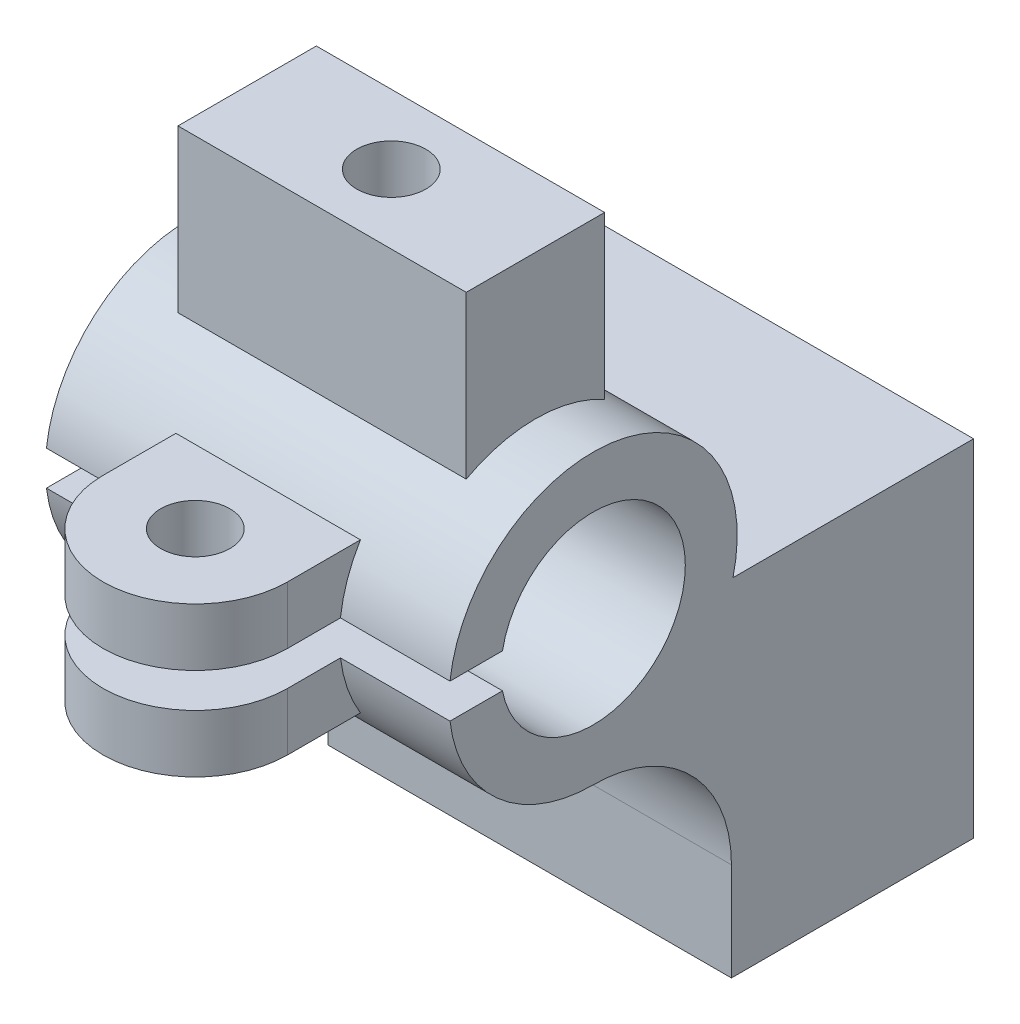
ISO-10303-21;
HEADER;
FILE_DESCRIPTION(('STEP AP214'),'2;1');
FILE_NAME('part.step','',(''),(''),'','','');
FILE_SCHEMA(('AUTOMOTIVE_DESIGN { 1 0 10303 214 1 1 1 1 }'));
ENDSEC;
DATA;
#1=APPLICATION_CONTEXT('core data for automotive mechanical design processes');
#2=APPLICATION_PROTOCOL_DEFINITION('international standard','automotive_design',2000,#1);
#3=PRODUCT_CONTEXT('',#1,'mechanical');
#4=PRODUCT('Part','Part','',(#3));
#5=PRODUCT_RELATED_PRODUCT_CATEGORY('part','',(#4));
#6=PRODUCT_DEFINITION_FORMATION('','',#4);
#7=PRODUCT_DEFINITION_CONTEXT('part definition',#1,'design');
#8=PRODUCT_DEFINITION('design','',#6,#7);
#9=PRODUCT_DEFINITION_SHAPE('','',#8);
#10=(LENGTH_UNIT() NAMED_UNIT(*) SI_UNIT(.MILLI.,.METRE.));
#11=(NAMED_UNIT(*) PLANE_ANGLE_UNIT() SI_UNIT($,.RADIAN.));
#12=(NAMED_UNIT(*) SI_UNIT($,.STERADIAN.) SOLID_ANGLE_UNIT());
#13=UNCERTAINTY_MEASURE_WITH_UNIT(LENGTH_MEASURE(1.E-05),#10,'distance_accuracy_value','');
#14=(GEOMETRIC_REPRESENTATION_CONTEXT(3) GLOBAL_UNCERTAINTY_ASSIGNED_CONTEXT((#13)) GLOBAL_UNIT_ASSIGNED_CONTEXT((#10,
#11,#12)) REPRESENTATION_CONTEXT('',''));
#15=CARTESIAN_POINT('',(0.,0.,0.));
#16=DIRECTION('',(0.,0.,1.));
#17=DIRECTION('',(1.,0.,0.));
#18=AXIS2_PLACEMENT_3D('',#15,#16,#17);
#19=CARTESIAN_POINT('',(8.,6.49999999999988,0.));
#20=DIRECTION('',(0.,-1.,0.));
#21=DIRECTION('',(0.,0.,-1.));
#22=AXIS2_PLACEMENT_3D('',#19,#20,#21);
#23=PLANE('',#22);
#24=DIRECTION('',(0.,0.,1.));
#25=VECTOR('',#24,1.);
#26=CARTESIAN_POINT('',(-8.,6.49999999999988,0.));
#27=LINE('',#26,#25);
#28=CARTESIAN_POINT('',(-8.,6.49999999999988,10.6770782520314));
#29=VERTEX_POINT('',#28);
#30=CARTESIAN_POINT('',(-8.,6.49999999999987,17.));
#31=VERTEX_POINT('',#30);
#32=EDGE_CURVE('E759',#29,#31,#27,.T.);
#33=ORIENTED_EDGE('',*,*,#32,.T.);
#34=CARTESIAN_POINT('',(0.,6.49999999999987,17.));
#35=DIRECTION('',(0.,-1.,0.));
#36=DIRECTION('',(0.,0.,-1.));
#37=AXIS2_PLACEMENT_3D('',#34,#35,#36);
#38=CIRCLE('',#37,8.);
#39=CARTESIAN_POINT('',(8.,6.49999999999987,17.));
#40=VERTEX_POINT('',#39);
#41=EDGE_CURVE('E244',#31,#40,#38,.F.);
#42=ORIENTED_EDGE('',*,*,#41,.T.);
#43=DIRECTION('',(0.,0.,1.));
#44=VECTOR('',#43,1.);
#45=CARTESIAN_POINT('',(8.,6.49999999999988,0.));
#46=LINE('',#45,#44);
#47=CARTESIAN_POINT('',(8.,6.49999999999988,10.6770782520314));
#48=VERTEX_POINT('',#47);
#49=EDGE_CURVE('E742',#48,#40,#46,.T.);
#50=ORIENTED_EDGE('',*,*,#49,.F.);
#51=DIRECTION('',(-1.,0.,0.));
#52=VECTOR('',#51,1.);
#53=CARTESIAN_POINT('',(8.,6.49999999999988,10.6770782520314));
#54=LINE('',#53,#52);
#55=EDGE_CURVE('E751',#48,#29,#54,.T.);
#56=ORIENTED_EDGE('',*,*,#55,.T.);
#57=EDGE_LOOP('',(#33,#42,#50,#56));
#58=FACE_BOUND('',#57,.T.);
#59=CARTESIAN_POINT('',(0.,6.49999999999987,17.));
#60=DIRECTION('',(0.,1.,0.));
#61=DIRECTION('',(0.,0.,1.));
#62=AXIS2_PLACEMENT_3D('',#59,#60,#61);
#63=CIRCLE('',#62,3.);
#64=CARTESIAN_POINT('',(0.,6.49999999999987,20.));
#65=VERTEX_POINT('',#64);
#66=EDGE_CURVE('E839',#65,#65,#63,.T.);
#67=ORIENTED_EDGE('',*,*,#66,.F.);
#68=EDGE_LOOP('',(#67));
#69=FACE_BOUND('',#68,.T.);
#70=ADVANCED_FACE('F47',(#58,#69),#23,.F.);
#71=CARTESIAN_POINT('',(0.,-1.49999999999993,17.));
#72=DIRECTION('',(0.,-1.,0.));
#73=DIRECTION('',(0.,0.,-1.));
#74=AXIS2_PLACEMENT_3D('',#71,#72,#73);
#75=CYLINDRICAL_SURFACE('',#74,8.);
#76=DIRECTION('',(0.,1.,0.));
#77=VECTOR('',#76,1.);
#78=CARTESIAN_POINT('',(8.,-1.49999999999993,17.));
#79=LINE('',#78,#77);
#80=CARTESIAN_POINT('',(8.,-1.49999999999993,17.));
#81=VERTEX_POINT('',#80);
#82=CARTESIAN_POINT('',(8.,-6.49999999999987,17.));
#83=VERTEX_POINT('',#82);
#84=EDGE_CURVE('E250',#81,#83,#79,.F.);
#85=ORIENTED_EDGE('',*,*,#84,.F.);
#86=CARTESIAN_POINT('',(0.,-1.5,17.));
#87=DIRECTION('',(0.,1.,0.));
#88=DIRECTION('',(0.,0.,1.));
#89=AXIS2_PLACEMENT_3D('',#86,#87,#88);
#90=CIRCLE('',#89,8.);
#91=CARTESIAN_POINT('',(-8.,-1.49999999999993,17.));
#92=VERTEX_POINT('',#91);
#93=EDGE_CURVE('E58',#92,#81,#90,.T.);
#94=ORIENTED_EDGE('',*,*,#93,.F.);
#95=DIRECTION('',(0.,-1.,0.));
#96=VECTOR('',#95,1.);
#97=CARTESIAN_POINT('',(-8.,0.,17.));
#98=LINE('',#97,#96);
#99=CARTESIAN_POINT('',(-8.,-6.49999999999987,17.));
#100=VERTEX_POINT('',#99);
#101=EDGE_CURVE('E253',#100,#92,#98,.F.);
#102=ORIENTED_EDGE('',*,*,#101,.F.);
#103=CARTESIAN_POINT('',(0.,-6.49999999999988,17.));
#104=DIRECTION('',(0.,-1.,0.));
#105=DIRECTION('',(0.,0.,-1.));
#106=AXIS2_PLACEMENT_3D('',#103,#104,#105);
#107=CIRCLE('',#106,8.);
#108=EDGE_CURVE('E11',#83,#100,#107,.T.);
#109=ORIENTED_EDGE('',*,*,#108,.F.);
#110=EDGE_LOOP('',(#85,#94,#102,#109));
#111=FACE_BOUND('',#110,.T.);
#112=ADVANCED_FACE('F50',(#111),#75,.T.);
#113=CARTESIAN_POINT('',(0.,6.49999999999987,17.));
#114=DIRECTION('',(0.,1.,0.));
#115=DIRECTION('',(0.,0.,1.));
#116=AXIS2_PLACEMENT_3D('',#113,#114,#115);
#117=CYLINDRICAL_SURFACE('',#116,8.);
#118=DIRECTION('',(0.,1.,0.));
#119=VECTOR('',#118,1.);
#120=CARTESIAN_POINT('',(8.,0.,17.));
#121=LINE('',#120,#119);
#122=CARTESIAN_POINT('',(8.,1.49999999999993,17.));
#123=VERTEX_POINT('',#122);
#124=EDGE_CURVE('E235',#40,#123,#121,.F.);
#125=ORIENTED_EDGE('',*,*,#124,.F.);
#126=ORIENTED_EDGE('',*,*,#41,.F.);
#127=DIRECTION('',(0.,-1.,0.));
#128=VECTOR('',#127,1.);
#129=CARTESIAN_POINT('',(-8.,6.49999999999987,17.));
#130=LINE('',#129,#128);
#131=CARTESIAN_POINT('',(-8.,1.49999999999993,17.));
#132=VERTEX_POINT('',#131);
#133=EDGE_CURVE('E239',#132,#31,#130,.F.);
#134=ORIENTED_EDGE('',*,*,#133,.F.);
#135=CARTESIAN_POINT('',(0.,1.5,17.));
#136=DIRECTION('',(0.,1.,0.));
#137=DIRECTION('',(0.,0.,1.));
#138=AXIS2_PLACEMENT_3D('',#135,#136,#137);
#139=CIRCLE('',#138,8.);
#140=EDGE_CURVE('E247',#123,#132,#139,.F.);
#141=ORIENTED_EDGE('',*,*,#140,.F.);
#142=EDGE_LOOP('',(#125,#126,#134,#141));
#143=FACE_BOUND('',#142,.T.);
#144=ADVANCED_FACE('F413',(#143),#117,.T.);
#145=CARTESIAN_POINT('',(-17.5,-1.5,0.));
#146=DIRECTION('',(0.,1.,0.));
#147=DIRECTION('',(0.,0.,1.));
#148=AXIS2_PLACEMENT_3D('',#145,#146,#147);
#149=PLANE('',#148);
#150=CARTESIAN_POINT('',(0.,-1.5,17.));
#151=DIRECTION('',(0.,1.,0.));
#152=DIRECTION('',(0.,0.,1.));
#153=AXIS2_PLACEMENT_3D('',#150,#151,#152);
#154=CIRCLE('',#153,3.);
#155=CARTESIAN_POINT('',(0.,-1.5,20.));
#156=VERTEX_POINT('',#155);
#157=EDGE_CURVE('E828',#156,#156,#154,.T.);
#158=ORIENTED_EDGE('',*,*,#157,.F.);
#159=EDGE_LOOP('',(#158));
#160=FACE_BOUND('',#159,.T.);
#161=DIRECTION('',(0.,0.,1.));
#162=VECTOR('',#161,1.);
#163=CARTESIAN_POINT('',(-8.,-1.50000000000006,0.));
#164=LINE('',#163,#162);
#165=CARTESIAN_POINT('',(-8.,-1.5,12.4096736459909));
#166=VERTEX_POINT('',#165);
#167=EDGE_CURVE('E822',#166,#92,#164,.T.);
#168=ORIENTED_EDGE('',*,*,#167,.T.);
#169=ORIENTED_EDGE('',*,*,#93,.T.);
#170=DIRECTION('',(0.,0.,1.));
#171=VECTOR('',#170,1.);
#172=CARTESIAN_POINT('',(8.,-1.50000000000006,0.));
#173=LINE('',#172,#171);
#174=CARTESIAN_POINT('',(8.,-1.5,12.4096736459909));
#175=VERTEX_POINT('',#174);
#176=EDGE_CURVE('E196',#175,#81,#173,.T.);
#177=ORIENTED_EDGE('',*,*,#176,.F.);
#178=DIRECTION('',(1.,0.,0.));
#179=VECTOR('',#178,1.);
#180=CARTESIAN_POINT('',(-17.5,-1.5,12.4096736459909));
#181=LINE('',#180,#179);
#182=CARTESIAN_POINT('',(17.5,-1.5,12.4096736459909));
#183=VERTEX_POINT('',#182);
#184=EDGE_CURVE('E202',#175,#183,#181,.T.);
#185=ORIENTED_EDGE('',*,*,#184,.T.);
#186=DIRECTION('',(0.,0.,1.));
#187=VECTOR('',#186,1.);
#188=CARTESIAN_POINT('',(17.5,-1.5,0.));
#189=LINE('',#188,#187);
#190=CARTESIAN_POINT('',(17.5,-1.5,7.85811682275086));
#191=VERTEX_POINT('',#190);
#192=EDGE_CURVE('E303',#191,#183,#189,.T.);
#193=ORIENTED_EDGE('',*,*,#192,.F.);
#194=DIRECTION('',(1.,0.,0.));
#195=VECTOR('',#194,1.);
#196=CARTESIAN_POINT('',(-17.5,-1.5,7.85811682275086));
#197=LINE('',#196,#195);
#198=CARTESIAN_POINT('',(-17.5,-1.5,7.85811682275086));
#199=VERTEX_POINT('',#198);
#200=EDGE_CURVE('E240',#199,#191,#197,.T.);
#201=ORIENTED_EDGE('',*,*,#200,.F.);
#202=DIRECTION('',(0.,0.,1.));
#203=VECTOR('',#202,1.);
#204=CARTESIAN_POINT('',(-17.5,-1.5,0.));
#205=LINE('',#204,#203);
#206=CARTESIAN_POINT('',(-17.5,-1.5,12.4096736459909));
#207=VERTEX_POINT('',#206);
#208=EDGE_CURVE('E334',#199,#207,#205,.T.);
#209=ORIENTED_EDGE('',*,*,#208,.T.);
#210=EDGE_CURVE('E223',#207,#166,#181,.T.);
#211=ORIENTED_EDGE('',*,*,#210,.T.);
#212=EDGE_LOOP('',(#168,#169,#177,#185,#193,#201,#209,#211));
#213=FACE_BOUND('',#212,.T.);
#214=ADVANCED_FACE('F199',(#160,#213),#149,.T.);
#215=CARTESIAN_POINT('',(-17.5,0.,0.));
#216=DIRECTION('',(1.,0.,0.));
#217=DIRECTION('',(0.,0.,-1.));
#218=AXIS2_PLACEMENT_3D('',#215,#216,#217);
#219=CYLINDRICAL_SURFACE('',#218,8.);
#220=CARTESIAN_POINT('',(17.5,0.,0.));
#221=DIRECTION('',(1.,0.,0.));
#222=DIRECTION('',(0.,0.,-1.));
#223=AXIS2_PLACEMENT_3D('',#220,#221,#222);
#224=CIRCLE('',#223,8.);
#225=CARTESIAN_POINT('',(17.5,1.5,7.85811682275086));
#226=VERTEX_POINT('',#225);
#227=EDGE_CURVE('E332',#191,#226,#224,.T.);
#228=ORIENTED_EDGE('',*,*,#227,.T.);
#229=DIRECTION('',(1.,0.,0.));
#230=VECTOR('',#229,1.);
#231=CARTESIAN_POINT('',(-17.5,1.5,7.85811682275086));
#232=LINE('',#231,#230);
#233=CARTESIAN_POINT('',(-17.5,1.5,7.85811682275086));
#234=VERTEX_POINT('',#233);
#235=EDGE_CURVE('E259',#234,#226,#232,.T.);
#236=ORIENTED_EDGE('',*,*,#235,.F.);
#237=CARTESIAN_POINT('',(-17.5,0.,0.));
#238=DIRECTION('',(1.,0.,0.));
#239=DIRECTION('',(0.,0.,-1.));
#240=AXIS2_PLACEMENT_3D('',#237,#238,#239);
#241=CIRCLE('',#240,8.);
#242=EDGE_CURVE('E224',#199,#234,#241,.T.);
#243=ORIENTED_EDGE('',*,*,#242,.F.);
#244=ORIENTED_EDGE('',*,*,#200,.T.);
#245=EDGE_LOOP('',(#228,#236,#243,#244));
#246=FACE_BOUND('',#245,.T.);
#247=ADVANCED_FACE('F404',(#246),#219,.F.);
#248=CARTESIAN_POINT('',(-17.5,1.5,0.));
#249=DIRECTION('',(0.,1.,0.));
#250=DIRECTION('',(0.,0.,1.));
#251=AXIS2_PLACEMENT_3D('',#248,#249,#250);
#252=PLANE('',#251);
#253=CARTESIAN_POINT('',(0.,1.5,17.));
#254=DIRECTION('',(0.,1.,0.));
#255=DIRECTION('',(0.,0.,1.));
#256=AXIS2_PLACEMENT_3D('',#253,#254,#255);
#257=CIRCLE('',#256,3.);
#258=CARTESIAN_POINT('',(0.,1.5,20.));
#259=VERTEX_POINT('',#258);
#260=EDGE_CURVE('E832',#259,#259,#257,.T.);
#261=ORIENTED_EDGE('',*,*,#260,.T.);
#262=EDGE_LOOP('',(#261));
#263=FACE_BOUND('',#262,.T.);
#264=DIRECTION('',(0.,0.,1.));
#265=VECTOR('',#264,1.);
#266=CARTESIAN_POINT('',(8.,1.50000000000006,0.));
#267=LINE('',#266,#265);
#268=CARTESIAN_POINT('',(8.,1.5,12.4096736459909));
#269=VERTEX_POINT('',#268);
#270=EDGE_CURVE('E747',#269,#123,#267,.T.);
#271=ORIENTED_EDGE('',*,*,#270,.T.);
#272=ORIENTED_EDGE('',*,*,#140,.T.);
#273=DIRECTION('',(0.,0.,1.));
#274=VECTOR('',#273,1.);
#275=CARTESIAN_POINT('',(-8.,1.50000000000006,0.));
#276=LINE('',#275,#274);
#277=CARTESIAN_POINT('',(-8.,1.5,12.4096736459909));
#278=VERTEX_POINT('',#277);
#279=EDGE_CURVE('E380',#278,#132,#276,.T.);
#280=ORIENTED_EDGE('',*,*,#279,.F.);
#281=DIRECTION('',(1.,0.,0.));
#282=VECTOR('',#281,1.);
#283=CARTESIAN_POINT('',(-17.5,1.5,12.4096736459909));
#284=LINE('',#283,#282);
#285=CARTESIAN_POINT('',(-17.5,1.5,12.4096736459909));
#286=VERTEX_POINT('',#285);
#287=EDGE_CURVE('E263',#286,#278,#284,.T.);
#288=ORIENTED_EDGE('',*,*,#287,.F.);
#289=DIRECTION('',(0.,0.,1.));
#290=VECTOR('',#289,1.);
#291=CARTESIAN_POINT('',(-17.5,1.5,0.));
#292=LINE('',#291,#290);
#293=EDGE_CURVE('E230',#234,#286,#292,.T.);
#294=ORIENTED_EDGE('',*,*,#293,.F.);
#295=ORIENTED_EDGE('',*,*,#235,.T.);
#296=DIRECTION('',(0.,0.,1.));
#297=VECTOR('',#296,1.);
#298=CARTESIAN_POINT('',(17.5,1.5,0.));
#299=LINE('',#298,#297);
#300=CARTESIAN_POINT('',(17.5,1.5,12.4096736459909));
#301=VERTEX_POINT('',#300);
#302=EDGE_CURVE('E328',#226,#301,#299,.T.);
#303=ORIENTED_EDGE('',*,*,#302,.T.);
#304=EDGE_CURVE('E267',#269,#301,#284,.T.);
#305=ORIENTED_EDGE('',*,*,#304,.F.);
#306=EDGE_LOOP('',(#271,#272,#280,#288,#294,#295,#303,#305));
#307=FACE_BOUND('',#306,.T.);
#308=ADVANCED_FACE('F378',(#263,#307),#252,.F.);
#309=CARTESIAN_POINT('',(-17.5,0.,0.));
#310=DIRECTION('',(1.,0.,0.));
#311=DIRECTION('',(0.,0.,-1.));
#312=AXIS2_PLACEMENT_3D('',#309,#310,#311);
#313=CYLINDRICAL_SURFACE('',#312,12.5);
#314=CARTESIAN_POINT('',(8.,0.,0.));
#315=DIRECTION('',(1.,0.,0.));
#316=DIRECTION('',(0.,0.,-1.));
#317=AXIS2_PLACEMENT_3D('',#314,#315,#316);
#318=CIRCLE('',#317,12.5);
#319=EDGE_CURVE('E743',#48,#269,#318,.T.);
#320=ORIENTED_EDGE('',*,*,#319,.T.);
#321=ORIENTED_EDGE('',*,*,#304,.T.);
#322=CARTESIAN_POINT('',(17.5,0.,0.));
#323=DIRECTION('',(1.,0.,0.));
#324=DIRECTION('',(0.,0.,-1.));
#325=AXIS2_PLACEMENT_3D('',#322,#323,#324);
#326=CIRCLE('',#325,12.5);
#327=CARTESIAN_POINT('',(17.5,-3.,-12.1346610995116));
#328=VERTEX_POINT('',#327);
#329=EDGE_CURVE('E324',#328,#301,#326,.T.);
#330=ORIENTED_EDGE('',*,*,#329,.F.);
#331=DIRECTION('',(1.,0.,0.));
#332=VECTOR('',#331,1.);
#333=CARTESIAN_POINT('',(-17.5,-3.,-12.1346610995116));
#334=LINE('',#333,#332);
#335=CARTESIAN_POINT('',(-17.5,-3.,-12.1346610995116));
#336=VERTEX_POINT('',#335);
#337=EDGE_CURVE('E270',#336,#328,#334,.T.);
#338=ORIENTED_EDGE('',*,*,#337,.F.);
#339=CARTESIAN_POINT('',(-17.5,0.,0.));
#340=DIRECTION('',(1.,0.,0.));
#341=DIRECTION('',(0.,0.,-1.));
#342=AXIS2_PLACEMENT_3D('',#339,#340,#341);
#343=CIRCLE('',#342,12.5);
#344=EDGE_CURVE('E363',#336,#286,#343,.T.);
#345=ORIENTED_EDGE('',*,*,#344,.T.);
#346=ORIENTED_EDGE('',*,*,#287,.T.);
#347=CARTESIAN_POINT('',(-8.,0.,0.));
#348=DIRECTION('',(1.,0.,0.));
#349=DIRECTION('',(0.,0.,-1.));
#350=AXIS2_PLACEMENT_3D('',#347,#348,#349);
#351=CIRCLE('',#350,12.5);
#352=EDGE_CURVE('E756',#29,#278,#351,.T.);
#353=ORIENTED_EDGE('',*,*,#352,.F.);
#354=ORIENTED_EDGE('',*,*,#55,.F.);
#355=EDGE_LOOP('',(#320,#321,#330,#338,#345,#346,#353,#354));
#356=FACE_BOUND('',#355,.T.);
#357=CARTESIAN_POINT('',(12.5,0.,0.));
#358=DIRECTION('',(1.,0.,0.));
#359=DIRECTION('',(0.,0.,-1.));
#360=AXIS2_PLACEMENT_3D('',#357,#358,#359);
#361=CIRCLE('',#360,12.5);
#362=CARTESIAN_POINT('',(12.5,10.9658560997307,-6.));
#363=VERTEX_POINT('',#362);
#364=CARTESIAN_POINT('',(12.5,10.9658560997307,6.));
#365=VERTEX_POINT('',#364);
#366=EDGE_CURVE('E768',#363,#365,#361,.T.);
#367=ORIENTED_EDGE('',*,*,#366,.T.);
#368=DIRECTION('',(-1.,0.,0.));
#369=VECTOR('',#368,1.);
#370=CARTESIAN_POINT('',(12.5,10.9658560997307,6.));
#371=LINE('',#370,#369);
#372=CARTESIAN_POINT('',(-12.5,10.9658560997307,6.));
#373=VERTEX_POINT('',#372);
#374=EDGE_CURVE('E783',#365,#373,#371,.T.);
#375=ORIENTED_EDGE('',*,*,#374,.T.);
#376=CARTESIAN_POINT('',(-12.5,0.,0.));
#377=DIRECTION('',(1.,0.,0.));
#378=DIRECTION('',(0.,0.,-1.));
#379=AXIS2_PLACEMENT_3D('',#376,#377,#378);
#380=CIRCLE('',#379,12.5);
#381=CARTESIAN_POINT('',(-12.5,10.9658560997307,-6.));
#382=VERTEX_POINT('',#381);
#383=EDGE_CURVE('E767',#382,#373,#380,.T.);
#384=ORIENTED_EDGE('',*,*,#383,.F.);
#385=DIRECTION('',(-1.,0.,0.));
#386=VECTOR('',#385,1.);
#387=CARTESIAN_POINT('',(12.5,10.9658560997307,-6.));
#388=LINE('',#387,#386);
#389=EDGE_CURVE('E307',#363,#382,#388,.T.);
#390=ORIENTED_EDGE('',*,*,#389,.F.);
#391=EDGE_LOOP('',(#367,#375,#384,#390));
#392=FACE_BOUND('',#391,.T.);
#393=ADVANCED_FACE('F384',(#356,#392),#313,.T.);
#394=CARTESIAN_POINT('',(-17.5,-3.,0.));
#395=DIRECTION('',(0.,1.,0.));
#396=DIRECTION('',(0.,0.,1.));
#397=AXIS2_PLACEMENT_3D('',#394,#395,#396);
#398=PLANE('',#397);
#399=DIRECTION('',(0.,0.,1.));
#400=VECTOR('',#399,1.);
#401=CARTESIAN_POINT('',(17.5,-3.,0.));
#402=LINE('',#401,#400);
#403=CARTESIAN_POINT('',(17.5,-3.,-33.));
#404=VERTEX_POINT('',#403);
#405=EDGE_CURVE('E320',#404,#328,#402,.T.);
#406=ORIENTED_EDGE('',*,*,#405,.F.);
#407=DIRECTION('',(1.,0.,0.));
#408=VECTOR('',#407,1.);
#409=CARTESIAN_POINT('',(-17.5,-3.,-33.));
#410=LINE('',#409,#408);
#411=CARTESIAN_POINT('',(-17.5,-3.,-33.));
#412=VERTEX_POINT('',#411);
#413=EDGE_CURVE('E272',#412,#404,#410,.T.);
#414=ORIENTED_EDGE('',*,*,#413,.F.);
#415=DIRECTION('',(0.,0.,1.));
#416=VECTOR('',#415,1.);
#417=CARTESIAN_POINT('',(-17.5,-3.,0.));
#418=LINE('',#417,#416);
#419=EDGE_CURVE('E359',#412,#336,#418,.T.);
#420=ORIENTED_EDGE('',*,*,#419,.T.);
#421=ORIENTED_EDGE('',*,*,#337,.T.);
#422=EDGE_LOOP('',(#406,#414,#420,#421));
#423=FACE_BOUND('',#422,.T.);
#424=ADVANCED_FACE('F389',(#423),#398,.T.);
#425=CARTESIAN_POINT('',(-17.5,0.,-33.));
#426=DIRECTION('',(0.,0.,1.));
#427=DIRECTION('',(0.,-1.,0.));
#428=AXIS2_PLACEMENT_3D('',#425,#426,#427);
#429=PLANE('',#428);
#430=DIRECTION('',(0.,-1.,0.));
#431=VECTOR('',#430,1.);
#432=CARTESIAN_POINT('',(17.5,0.,-33.));
#433=LINE('',#432,#431);
#434=CARTESIAN_POINT('',(17.5,-33.,-33.));
#435=VERTEX_POINT('',#434);
#436=EDGE_CURVE('E316',#404,#435,#433,.T.);
#437=ORIENTED_EDGE('',*,*,#436,.T.);
#438=DIRECTION('',(1.,0.,0.));
#439=VECTOR('',#438,1.);
#440=CARTESIAN_POINT('',(-17.5,-33.,-33.));
#441=LINE('',#440,#439);
#442=CARTESIAN_POINT('',(-17.5,-33.,-33.));
#443=VERTEX_POINT('',#442);
#444=EDGE_CURVE('E275',#443,#435,#441,.T.);
#445=ORIENTED_EDGE('',*,*,#444,.F.);
#446=DIRECTION('',(0.,-1.,0.));
#447=VECTOR('',#446,1.);
#448=CARTESIAN_POINT('',(-17.5,0.,-33.));
#449=LINE('',#448,#447);
#450=EDGE_CURVE('E356',#412,#443,#449,.T.);
#451=ORIENTED_EDGE('',*,*,#450,.F.);
#452=ORIENTED_EDGE('',*,*,#413,.T.);
#453=EDGE_LOOP('',(#437,#445,#451,#452));
#454=FACE_BOUND('',#453,.T.);
#455=ADVANCED_FACE('F394',(#454),#429,.F.);
#456=CARTESIAN_POINT('',(-17.5,-33.,0.));
#457=DIRECTION('',(0.,-1.,0.));
#458=DIRECTION('',(0.,0.,-1.));
#459=AXIS2_PLACEMENT_3D('',#456,#457,#458);
#460=PLANE('',#459);
#461=DIRECTION('',(0.,0.,-1.));
#462=VECTOR('',#461,1.);
#463=CARTESIAN_POINT('',(17.5,-33.,0.));
#464=LINE('',#463,#462);
#465=CARTESIAN_POINT('',(17.5,-33.,-12.));
#466=VERTEX_POINT('',#465);
#467=EDGE_CURVE('E312',#466,#435,#464,.T.);
#468=ORIENTED_EDGE('',*,*,#467,.F.);
#469=DIRECTION('',(1.,0.,0.));
#470=VECTOR('',#469,1.);
#471=CARTESIAN_POINT('',(-17.5,-33.,-12.));
#472=LINE('',#471,#470);
#473=CARTESIAN_POINT('',(-17.5,-33.,-12.));
#474=VERTEX_POINT('',#473);
#475=EDGE_CURVE('E278',#474,#466,#472,.T.);
#476=ORIENTED_EDGE('',*,*,#475,.F.);
#477=DIRECTION('',(0.,0.,-1.));
#478=VECTOR('',#477,1.);
#479=CARTESIAN_POINT('',(-17.5,-33.,0.));
#480=LINE('',#479,#478);
#481=EDGE_CURVE('E352',#474,#443,#480,.T.);
#482=ORIENTED_EDGE('',*,*,#481,.T.);
#483=ORIENTED_EDGE('',*,*,#444,.T.);
#484=EDGE_LOOP('',(#468,#476,#482,#483));
#485=FACE_BOUND('',#484,.T.);
#486=ADVANCED_FACE('F398',(#485),#460,.T.);
#487=CARTESIAN_POINT('',(-17.5,0.,-12.));
#488=DIRECTION('',(0.,0.,-1.));
#489=DIRECTION('',(0.,1.,0.));
#490=AXIS2_PLACEMENT_3D('',#487,#488,#489);
#491=PLANE('',#490);
#492=DIRECTION('',(0.,1.,0.));
#493=VECTOR('',#492,1.);
#494=CARTESIAN_POINT('',(17.5,0.,-12.));
#495=LINE('',#494,#493);
#496=CARTESIAN_POINT('',(17.5,-24.5,-12.));
#497=VERTEX_POINT('',#496);
#498=EDGE_CURVE('E299',#466,#497,#495,.T.);
#499=ORIENTED_EDGE('',*,*,#498,.T.);
#500=DIRECTION('',(1.,0.,0.));
#501=VECTOR('',#500,1.);
#502=CARTESIAN_POINT('',(-17.5,-24.5,-12.));
#503=LINE('',#502,#501);
#504=CARTESIAN_POINT('',(-17.5,-24.5,-12.));
#505=VERTEX_POINT('',#504);
#506=EDGE_CURVE('E281',#505,#497,#503,.T.);
#507=ORIENTED_EDGE('',*,*,#506,.F.);
#508=DIRECTION('',(0.,1.,0.));
#509=VECTOR('',#508,1.);
#510=CARTESIAN_POINT('',(-17.5,0.,-12.));
#511=LINE('',#510,#509);
#512=EDGE_CURVE('E349',#474,#505,#511,.T.);
#513=ORIENTED_EDGE('',*,*,#512,.F.);
#514=ORIENTED_EDGE('',*,*,#475,.T.);
#515=EDGE_LOOP('',(#499,#507,#513,#514));
#516=FACE_BOUND('',#515,.T.);
#517=ADVANCED_FACE('F401',(#516),#491,.F.);
#518=CARTESIAN_POINT('',(-17.5,-24.5,0.));
#519=DIRECTION('',(1.,0.,0.));
#520=DIRECTION('',(0.,0.,-1.));
#521=AXIS2_PLACEMENT_3D('',#518,#519,#520);
#522=CYLINDRICAL_SURFACE('',#521,12.);
#523=CARTESIAN_POINT('',(17.5,-24.5,0.));
#524=DIRECTION('',(1.,0.,0.));
#525=DIRECTION('',(0.,0.,-1.));
#526=AXIS2_PLACEMENT_3D('',#523,#524,#525);
#527=CIRCLE('',#526,12.);
#528=CARTESIAN_POINT('',(17.5,-12.5,0.));
#529=VERTEX_POINT('',#528);
#530=EDGE_CURVE('E293',#497,#529,#527,.T.);
#531=ORIENTED_EDGE('',*,*,#530,.T.);
#532=DIRECTION('',(1.,0.,0.));
#533=VECTOR('',#532,1.);
#534=CARTESIAN_POINT('',(-17.5,-12.5,0.));
#535=LINE('',#534,#533);
#536=CARTESIAN_POINT('',(-17.5,-12.5,0.));
#537=VERTEX_POINT('',#536);
#538=EDGE_CURVE('E229',#537,#529,#535,.T.);
#539=ORIENTED_EDGE('',*,*,#538,.F.);
#540=CARTESIAN_POINT('',(-17.5,-24.5,0.));
#541=DIRECTION('',(1.,0.,0.));
#542=DIRECTION('',(0.,0.,-1.));
#543=AXIS2_PLACEMENT_3D('',#540,#541,#542);
#544=CIRCLE('',#543,12.);
#545=EDGE_CURVE('E342',#505,#537,#544,.T.);
#546=ORIENTED_EDGE('',*,*,#545,.F.);
#547=ORIENTED_EDGE('',*,*,#506,.T.);
#548=EDGE_LOOP('',(#531,#539,#546,#547));
#549=FACE_BOUND('',#548,.T.);
#550=ADVANCED_FACE('F294',(#549),#522,.F.);
#551=CARTESIAN_POINT('',(-17.5,0.,0.));
#552=DIRECTION('',(1.,0.,0.));
#553=DIRECTION('',(0.,0.,-1.));
#554=AXIS2_PLACEMENT_3D('',#551,#552,#553);
#555=CYLINDRICAL_SURFACE('',#554,12.5);
#556=CARTESIAN_POINT('',(8.,0.,0.));
#557=DIRECTION('',(1.,0.,0.));
#558=DIRECTION('',(0.,0.,-1.));
#559=AXIS2_PLACEMENT_3D('',#556,#557,#558);
#560=CIRCLE('',#559,12.5);
#561=CARTESIAN_POINT('',(8.,-6.49999999999988,10.6770782520314));
#562=VERTEX_POINT('',#561);
#563=EDGE_CURVE('E208',#175,#562,#560,.T.);
#564=ORIENTED_EDGE('',*,*,#563,.T.);
#565=DIRECTION('',(-1.,0.,0.));
#566=VECTOR('',#565,1.);
#567=CARTESIAN_POINT('',(8.,-6.49999999999988,10.6770782520314));
#568=LINE('',#567,#566);
#569=CARTESIAN_POINT('',(-8.,-6.49999999999988,10.6770782520314));
#570=VERTEX_POINT('',#569);
#571=EDGE_CURVE('E760',#562,#570,#568,.T.);
#572=ORIENTED_EDGE('',*,*,#571,.T.);
#573=CARTESIAN_POINT('',(-8.,0.,0.));
#574=DIRECTION('',(1.,0.,0.));
#575=DIRECTION('',(0.,0.,-1.));
#576=AXIS2_PLACEMENT_3D('',#573,#574,#575);
#577=CIRCLE('',#576,12.5);
#578=EDGE_CURVE('E825',#166,#570,#577,.T.);
#579=ORIENTED_EDGE('',*,*,#578,.F.);
#580=ORIENTED_EDGE('',*,*,#210,.F.);
#581=CARTESIAN_POINT('',(-17.5,0.,0.));
#582=DIRECTION('',(1.,0.,0.));
#583=DIRECTION('',(0.,0.,-1.));
#584=AXIS2_PLACEMENT_3D('',#581,#582,#583);
#585=CIRCLE('',#584,12.5);
#586=EDGE_CURVE('E289',#207,#537,#585,.T.);
#587=ORIENTED_EDGE('',*,*,#586,.T.);
#588=ORIENTED_EDGE('',*,*,#538,.T.);
#589=CARTESIAN_POINT('',(17.5,0.,0.));
#590=DIRECTION('',(1.,0.,0.));
#591=DIRECTION('',(0.,0.,-1.));
#592=AXIS2_PLACEMENT_3D('',#589,#590,#591);
#593=CIRCLE('',#592,12.5);
#594=EDGE_CURVE('E220',#183,#529,#593,.T.);
#595=ORIENTED_EDGE('',*,*,#594,.F.);
#596=ORIENTED_EDGE('',*,*,#184,.F.);
#597=EDGE_LOOP('',(#564,#572,#579,#580,#587,#588,#595,#596));
#598=FACE_BOUND('',#597,.T.);
#599=ADVANCED_FACE('F218',(#598),#555,.T.);
#600=CARTESIAN_POINT('',(-17.5,0.,0.));
#601=DIRECTION('',(1.,0.,0.));
#602=DIRECTION('',(0.,0.,-1.));
#603=AXIS2_PLACEMENT_3D('',#600,#601,#602);
#604=PLANE('',#603);
#605=ORIENTED_EDGE('',*,*,#208,.F.);
#606=ORIENTED_EDGE('',*,*,#242,.T.);
#607=ORIENTED_EDGE('',*,*,#293,.T.);
#608=ORIENTED_EDGE('',*,*,#344,.F.);
#609=ORIENTED_EDGE('',*,*,#419,.F.);
#610=ORIENTED_EDGE('',*,*,#450,.T.);
#611=ORIENTED_EDGE('',*,*,#481,.F.);
#612=ORIENTED_EDGE('',*,*,#512,.T.);
#613=ORIENTED_EDGE('',*,*,#545,.T.);
#614=ORIENTED_EDGE('',*,*,#586,.F.);
#615=EDGE_LOOP('',(#605,#606,#607,#608,#609,#610,#611,#612,#613,#614));
#616=FACE_BOUND('',#615,.T.);
#617=ADVANCED_FACE('F372',(#616),#604,.F.);
#618=CARTESIAN_POINT('',(17.5,0.,0.));
#619=DIRECTION('',(1.,0.,0.));
#620=DIRECTION('',(0.,0.,-1.));
#621=AXIS2_PLACEMENT_3D('',#618,#619,#620);
#622=PLANE('',#621);
#623=ORIENTED_EDGE('',*,*,#192,.T.);
#624=ORIENTED_EDGE('',*,*,#594,.T.);
#625=ORIENTED_EDGE('',*,*,#530,.F.);
#626=ORIENTED_EDGE('',*,*,#498,.F.);
#627=ORIENTED_EDGE('',*,*,#467,.T.);
#628=ORIENTED_EDGE('',*,*,#436,.F.);
#629=ORIENTED_EDGE('',*,*,#405,.T.);
#630=ORIENTED_EDGE('',*,*,#329,.T.);
#631=ORIENTED_EDGE('',*,*,#302,.F.);
#632=ORIENTED_EDGE('',*,*,#227,.F.);
#633=EDGE_LOOP('',(#623,#624,#625,#626,#627,#628,#629,#630,#631,#632));
#634=FACE_BOUND('',#633,.T.);
#635=ADVANCED_FACE('F301',(#634),#622,.T.);
#636=CARTESIAN_POINT('',(12.5,0.,-6.));
#637=DIRECTION('',(0.,0.,-1.));
#638=DIRECTION('',(0.,1.,0.));
#639=AXIS2_PLACEMENT_3D('',#636,#637,#638);
#640=PLANE('',#639);
#641=DIRECTION('',(0.,-1.,0.));
#642=VECTOR('',#641,1.);
#643=CARTESIAN_POINT('',(-12.5,0.,-6.));
#644=LINE('',#643,#642);
#645=CARTESIAN_POINT('',(-12.5,25.,-6.));
#646=VERTEX_POINT('',#645);
#647=EDGE_CURVE('E787',#646,#382,#644,.T.);
#648=ORIENTED_EDGE('',*,*,#647,.F.);
#649=DIRECTION('',(-1.,0.,0.));
#650=VECTOR('',#649,1.);
#651=CARTESIAN_POINT('',(12.5,25.,-6.));
#652=LINE('',#651,#650);
#653=CARTESIAN_POINT('',(12.5,25.,-6.));
#654=VERTEX_POINT('',#653);
#655=EDGE_CURVE('E801',#654,#646,#652,.T.);
#656=ORIENTED_EDGE('',*,*,#655,.F.);
#657=DIRECTION('',(0.,-1.,0.));
#658=VECTOR('',#657,1.);
#659=CARTESIAN_POINT('',(12.5,0.,-6.));
#660=LINE('',#659,#658);
#661=EDGE_CURVE('E772',#654,#363,#660,.T.);
#662=ORIENTED_EDGE('',*,*,#661,.T.);
#663=ORIENTED_EDGE('',*,*,#389,.T.);
#664=EDGE_LOOP('',(#648,#656,#662,#663));
#665=FACE_BOUND('',#664,.T.);
#666=ADVANCED_FACE('F445',(#665),#640,.T.);
#667=CARTESIAN_POINT('',(12.5,25.,0.));
#668=DIRECTION('',(0.,-1.,0.));
#669=DIRECTION('',(0.,0.,-1.));
#670=AXIS2_PLACEMENT_3D('',#667,#668,#669);
#671=PLANE('',#670);
#672=CARTESIAN_POINT('',(0.,25.,0.));
#673=DIRECTION('',(0.,1.,0.));
#674=DIRECTION('',(0.,0.,1.));
#675=AXIS2_PLACEMENT_3D('',#672,#673,#674);
#676=CIRCLE('',#675,2.99999999999999);
#677=CARTESIAN_POINT('',(0.,25.,2.99999999999999));
#678=VERTEX_POINT('',#677);
#679=EDGE_CURVE('E846',#678,#678,#676,.T.);
#680=ORIENTED_EDGE('',*,*,#679,.F.);
#681=EDGE_LOOP('',(#680));
#682=FACE_BOUND('',#681,.T.);
#683=DIRECTION('',(0.,0.,1.));
#684=VECTOR('',#683,1.);
#685=CARTESIAN_POINT('',(-12.5,25.,0.));
#686=LINE('',#685,#684);
#687=CARTESIAN_POINT('',(-12.5,25.,6.));
#688=VERTEX_POINT('',#687);
#689=EDGE_CURVE('E790',#646,#688,#686,.T.);
#690=ORIENTED_EDGE('',*,*,#689,.T.);
#691=DIRECTION('',(-1.,0.,0.));
#692=VECTOR('',#691,1.);
#693=CARTESIAN_POINT('',(12.5,25.,6.));
#694=LINE('',#693,#692);
#695=CARTESIAN_POINT('',(12.5,25.,6.));
#696=VERTEX_POINT('',#695);
#697=EDGE_CURVE('E798',#696,#688,#694,.T.);
#698=ORIENTED_EDGE('',*,*,#697,.F.);
#699=DIRECTION('',(0.,0.,1.));
#700=VECTOR('',#699,1.);
#701=CARTESIAN_POINT('',(12.5,25.,0.));
#702=LINE('',#701,#700);
#703=EDGE_CURVE('E777',#654,#696,#702,.T.);
#704=ORIENTED_EDGE('',*,*,#703,.F.);
#705=ORIENTED_EDGE('',*,*,#655,.T.);
#706=EDGE_LOOP('',(#690,#698,#704,#705));
#707=FACE_BOUND('',#706,.T.);
#708=ADVANCED_FACE('F441',(#682,#707),#671,.F.);
#709=CARTESIAN_POINT('',(12.5,0.,6.));
#710=DIRECTION('',(0.,0.,-1.));
#711=DIRECTION('',(0.,1.,0.));
#712=AXIS2_PLACEMENT_3D('',#709,#710,#711);
#713=PLANE('',#712);
#714=DIRECTION('',(0.,-1.,0.));
#715=VECTOR('',#714,1.);
#716=CARTESIAN_POINT('',(-12.5,0.,6.));
#717=LINE('',#716,#715);
#718=EDGE_CURVE('E773',#688,#373,#717,.T.);
#719=ORIENTED_EDGE('',*,*,#718,.T.);
#720=ORIENTED_EDGE('',*,*,#374,.F.);
#721=DIRECTION('',(0.,-1.,0.));
#722=VECTOR('',#721,1.);
#723=CARTESIAN_POINT('',(12.5,0.,6.));
#724=LINE('',#723,#722);
#725=EDGE_CURVE('E780',#696,#365,#724,.T.);
#726=ORIENTED_EDGE('',*,*,#725,.F.);
#727=ORIENTED_EDGE('',*,*,#697,.T.);
#728=EDGE_LOOP('',(#719,#720,#726,#727));
#729=FACE_BOUND('',#728,.T.);
#730=ADVANCED_FACE('F433',(#729),#713,.F.);
#731=CARTESIAN_POINT('',(12.5,0.,0.));
#732=DIRECTION('',(1.,0.,0.));
#733=DIRECTION('',(0.,0.,-1.));
#734=AXIS2_PLACEMENT_3D('',#731,#732,#733);
#735=PLANE('',#734);
#736=ORIENTED_EDGE('',*,*,#366,.F.);
#737=ORIENTED_EDGE('',*,*,#661,.F.);
#738=ORIENTED_EDGE('',*,*,#703,.T.);
#739=ORIENTED_EDGE('',*,*,#725,.T.);
#740=EDGE_LOOP('',(#736,#737,#738,#739));
#741=FACE_BOUND('',#740,.T.);
#742=ADVANCED_FACE('F429',(#741),#735,.T.);
#743=CARTESIAN_POINT('',(-12.5,0.,0.));
#744=DIRECTION('',(1.,0.,0.));
#745=DIRECTION('',(0.,0.,-1.));
#746=AXIS2_PLACEMENT_3D('',#743,#744,#745);
#747=PLANE('',#746);
#748=ORIENTED_EDGE('',*,*,#383,.T.);
#749=ORIENTED_EDGE('',*,*,#718,.F.);
#750=ORIENTED_EDGE('',*,*,#689,.F.);
#751=ORIENTED_EDGE('',*,*,#647,.T.);
#752=EDGE_LOOP('',(#748,#749,#750,#751));
#753=FACE_BOUND('',#752,.T.);
#754=ADVANCED_FACE('F432',(#753),#747,.F.);
#755=CARTESIAN_POINT('',(8.,0.,0.));
#756=DIRECTION('',(1.,0.,0.));
#757=DIRECTION('',(0.,0.,-1.));
#758=AXIS2_PLACEMENT_3D('',#755,#756,#757);
#759=PLANE('',#758);
#760=ORIENTED_EDGE('',*,*,#49,.T.);
#761=ORIENTED_EDGE('',*,*,#124,.T.);
#762=ORIENTED_EDGE('',*,*,#270,.F.);
#763=ORIENTED_EDGE('',*,*,#319,.F.);
#764=EDGE_LOOP('',(#760,#761,#762,#763));
#765=FACE_BOUND('',#764,.T.);
#766=ADVANCED_FACE('F437',(#765),#759,.T.);
#767=CARTESIAN_POINT('',(-8.,0.,0.));
#768=DIRECTION('',(1.,0.,0.));
#769=DIRECTION('',(0.,0.,-1.));
#770=AXIS2_PLACEMENT_3D('',#767,#768,#769);
#771=PLANE('',#770);
#772=ORIENTED_EDGE('',*,*,#279,.T.);
#773=ORIENTED_EDGE('',*,*,#133,.T.);
#774=ORIENTED_EDGE('',*,*,#32,.F.);
#775=ORIENTED_EDGE('',*,*,#352,.T.);
#776=EDGE_LOOP('',(#772,#773,#774,#775));
#777=FACE_BOUND('',#776,.T.);
#778=ADVANCED_FACE('F427',(#777),#771,.F.);
#779=CARTESIAN_POINT('',(8.,-6.49999999999988,0.));
#780=DIRECTION('',(0.,-1.,0.));
#781=DIRECTION('',(0.,0.,-1.));
#782=AXIS2_PLACEMENT_3D('',#779,#780,#781);
#783=PLANE('',#782);
#784=CARTESIAN_POINT('',(0.,-6.49999999999987,17.));
#785=DIRECTION('',(0.,-1.,0.));
#786=DIRECTION('',(0.,0.,-1.));
#787=AXIS2_PLACEMENT_3D('',#784,#785,#786);
#788=CIRCLE('',#787,3.);
#789=CARTESIAN_POINT('',(0.,-6.49999999999987,14.));
#790=VERTEX_POINT('',#789);
#791=EDGE_CURVE('E52',#790,#790,#788,.T.);
#792=ORIENTED_EDGE('',*,*,#791,.F.);
#793=EDGE_LOOP('',(#792));
#794=FACE_BOUND('',#793,.T.);
#795=DIRECTION('',(0.,0.,1.));
#796=VECTOR('',#795,1.);
#797=CARTESIAN_POINT('',(8.,-6.49999999999988,0.));
#798=LINE('',#797,#796);
#799=EDGE_CURVE('E207',#562,#83,#798,.T.);
#800=ORIENTED_EDGE('',*,*,#799,.T.);
#801=ORIENTED_EDGE('',*,*,#108,.T.);
#802=DIRECTION('',(0.,0.,1.));
#803=VECTOR('',#802,1.);
#804=CARTESIAN_POINT('',(-8.,-6.49999999999988,0.));
#805=LINE('',#804,#803);
#806=EDGE_CURVE('E216',#570,#100,#805,.T.);
#807=ORIENTED_EDGE('',*,*,#806,.F.);
#808=ORIENTED_EDGE('',*,*,#571,.F.);
#809=EDGE_LOOP('',(#800,#801,#807,#808));
#810=FACE_BOUND('',#809,.T.);
#811=ADVANCED_FACE('F493',(#794,#810),#783,.T.);
#812=CARTESIAN_POINT('',(8.,0.,0.));
#813=DIRECTION('',(1.,0.,0.));
#814=DIRECTION('',(0.,0.,-1.));
#815=AXIS2_PLACEMENT_3D('',#812,#813,#814);
#816=PLANE('',#815);
#817=ORIENTED_EDGE('',*,*,#176,.T.);
#818=ORIENTED_EDGE('',*,*,#84,.T.);
#819=ORIENTED_EDGE('',*,*,#799,.F.);
#820=ORIENTED_EDGE('',*,*,#563,.F.);
#821=EDGE_LOOP('',(#817,#818,#819,#820));
#822=FACE_BOUND('',#821,.T.);
#823=ADVANCED_FACE('F212',(#822),#816,.T.);
#824=CARTESIAN_POINT('',(-8.,0.,0.));
#825=DIRECTION('',(1.,0.,0.));
#826=DIRECTION('',(0.,0.,-1.));
#827=AXIS2_PLACEMENT_3D('',#824,#825,#826);
#828=PLANE('',#827);
#829=ORIENTED_EDGE('',*,*,#806,.T.);
#830=ORIENTED_EDGE('',*,*,#101,.T.);
#831=ORIENTED_EDGE('',*,*,#167,.F.);
#832=ORIENTED_EDGE('',*,*,#578,.T.);
#833=EDGE_LOOP('',(#829,#830,#831,#832));
#834=FACE_BOUND('',#833,.T.);
#835=ADVANCED_FACE('F510',(#834),#828,.F.);
#836=CARTESIAN_POINT('',(0.,6.49999999999987,17.));
#837=DIRECTION('',(0.,1.,0.));
#838=DIRECTION('',(0.,0.,1.));
#839=AXIS2_PLACEMENT_3D('',#836,#837,#838);
#840=CYLINDRICAL_SURFACE('',#839,3.);
#841=ORIENTED_EDGE('',*,*,#66,.T.);
#842=EDGE_LOOP('',(#841));
#843=FACE_BOUND('',#842,.T.);
#844=ORIENTED_EDGE('',*,*,#260,.F.);
#845=EDGE_LOOP('',(#844));
#846=FACE_BOUND('',#845,.T.);
#847=ADVANCED_FACE('F517',(#843,#846),#840,.F.);
#848=ORIENTED_EDGE('',*,*,#157,.T.);
#849=EDGE_LOOP('',(#848));
#850=FACE_BOUND('',#849,.T.);
#851=ORIENTED_EDGE('',*,*,#791,.T.);
#852=EDGE_LOOP('',(#851));
#853=FACE_BOUND('',#852,.T.);
#854=ADVANCED_FACE('F524',(#850,#853),#840,.F.);
#855=CARTESIAN_POINT('',(0.,13.,0.));
#856=DIRECTION('',(0.,-1.,0.));
#857=DIRECTION('',(0.,0.,-1.));
#858=AXIS2_PLACEMENT_3D('',#855,#856,#857);
#859=PLANE('',#858);
#860=CARTESIAN_POINT('',(0.,13.,0.));
#861=DIRECTION('',(0.,1.,0.));
#862=DIRECTION('',(0.,0.,1.));
#863=AXIS2_PLACEMENT_3D('',#860,#861,#862);
#864=CIRCLE('',#863,3.);
#865=CARTESIAN_POINT('',(0.,13.,3.));
#866=VERTEX_POINT('',#865);
#867=EDGE_CURVE('E842',#866,#866,#864,.T.);
#868=ORIENTED_EDGE('',*,*,#867,.T.);
#869=EDGE_LOOP('',(#868));
#870=FACE_BOUND('',#869,.T.);
#871=ADVANCED_FACE('F531',(#870),#859,.F.);
#872=CARTESIAN_POINT('',(0.,25.,0.));
#873=DIRECTION('',(0.,1.,0.));
#874=DIRECTION('',(0.,0.,1.));
#875=AXIS2_PLACEMENT_3D('',#872,#873,#874);
#876=CYLINDRICAL_SURFACE('',#875,2.99999999999999);
#877=ORIENTED_EDGE('',*,*,#867,.F.);
#878=EDGE_LOOP('',(#877));
#879=FACE_BOUND('',#878,.T.);
#880=ORIENTED_EDGE('',*,*,#679,.T.);
#881=EDGE_LOOP('',(#880));
#882=FACE_BOUND('',#881,.T.);
#883=ADVANCED_FACE('F537',(#879,#882),#876,.F.);
#884=CLOSED_SHELL('',(#70,#112,#144,#214,#247,#308,#393,#424,#455,#486,#517,#550,#599,#617,#635,
#666,#708,#730,#742,#754,#766,#778,#811,#823,#835,#847,#854,#871,#883));
#885=MANIFOLD_SOLID_BREP('B2',#884);
#886=ADVANCED_BREP_SHAPE_REPRESENTATION('',(#18,#885),#14);
#887=SHAPE_DEFINITION_REPRESENTATION(#9,#886);
ENDSEC;
END-ISO-10303-21;
